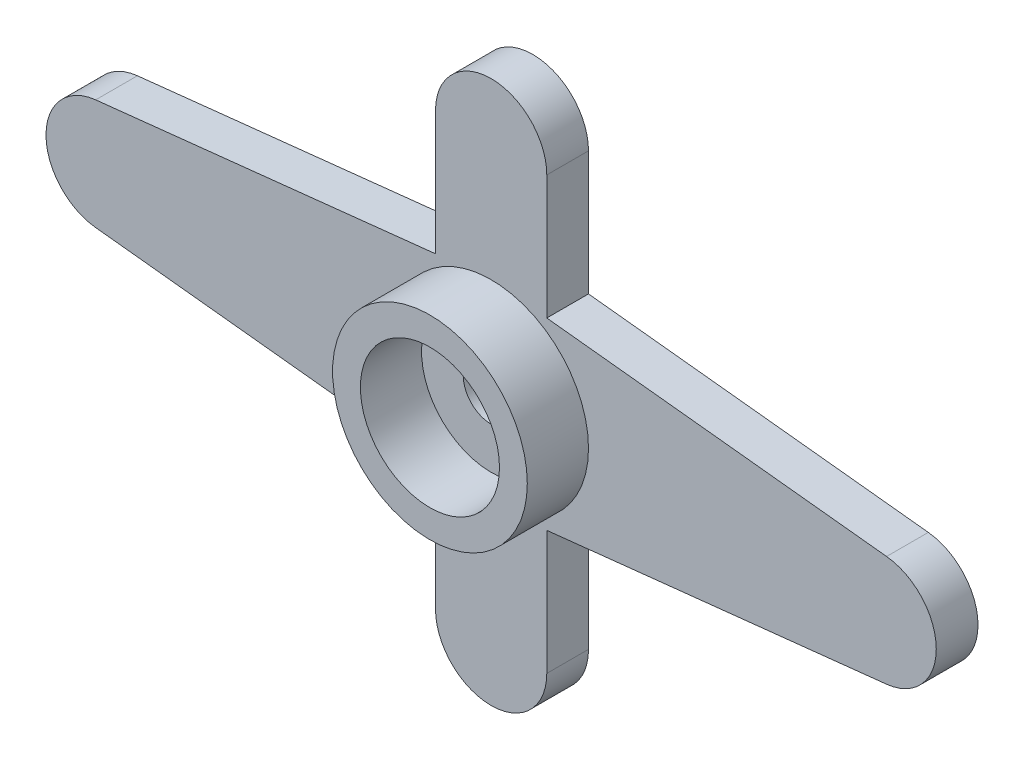
ISO-10303-21;
HEADER;
FILE_DESCRIPTION(('STEP AP214'),'2;1');
FILE_NAME('part.step','',(''),(''),'','','');
FILE_SCHEMA(('AUTOMOTIVE_DESIGN { 1 0 10303 214 1 1 1 1 }'));
ENDSEC;
DATA;
#1=APPLICATION_CONTEXT('core data for automotive mechanical design processes');
#2=APPLICATION_PROTOCOL_DEFINITION('international standard','automotive_design',2000,#1);
#3=PRODUCT_CONTEXT('',#1,'mechanical');
#4=PRODUCT('Part','Part','',(#3));
#5=PRODUCT_RELATED_PRODUCT_CATEGORY('part','',(#4));
#6=PRODUCT_DEFINITION_FORMATION('','',#4);
#7=PRODUCT_DEFINITION_CONTEXT('part definition',#1,'design');
#8=PRODUCT_DEFINITION('design','',#6,#7);
#9=PRODUCT_DEFINITION_SHAPE('','',#8);
#10=(LENGTH_UNIT() NAMED_UNIT(*) SI_UNIT(.MILLI.,.METRE.));
#11=(NAMED_UNIT(*) PLANE_ANGLE_UNIT() SI_UNIT($,.RADIAN.));
#12=(NAMED_UNIT(*) SI_UNIT($,.STERADIAN.) SOLID_ANGLE_UNIT());
#13=UNCERTAINTY_MEASURE_WITH_UNIT(LENGTH_MEASURE(1.E-05),#10,'distance_accuracy_value','');
#14=(GEOMETRIC_REPRESENTATION_CONTEXT(3) GLOBAL_UNCERTAINTY_ASSIGNED_CONTEXT((#13)) GLOBAL_UNIT_ASSIGNED_CONTEXT((#10,
#11,#12)) REPRESENTATION_CONTEXT('',''));
#15=CARTESIAN_POINT('',(0.,0.,0.));
#16=DIRECTION('',(0.,0.,1.));
#17=DIRECTION('',(1.,0.,0.));
#18=AXIS2_PLACEMENT_3D('',#15,#16,#17);
#19=CARTESIAN_POINT('',(0.,0.,-0.000999999999999916));
#20=DIRECTION('',(0.,0.,1.));
#21=DIRECTION('',(1.,0.,0.));
#22=AXIS2_PLACEMENT_3D('',#19,#20,#21);
#23=CYLINDRICAL_SURFACE('',#22,1.);
#24=CARTESIAN_POINT('',(0.,0.,1.5));
#25=DIRECTION('',(0.,0.,1.));
#26=DIRECTION('',(1.,0.,0.));
#27=AXIS2_PLACEMENT_3D('',#24,#25,#26);
#28=CIRCLE('',#27,1.);
#29=CARTESIAN_POINT('',(1.,0.,1.5));
#30=VERTEX_POINT('',#29);
#31=EDGE_CURVE('E452',#30,#30,#28,.T.);
#32=ORIENTED_EDGE('',*,*,#31,.T.);
#33=EDGE_LOOP('',(#32));
#34=FACE_BOUND('',#33,.T.);
#35=CARTESIAN_POINT('',(0.,0.,1.));
#36=DIRECTION('',(0.,0.,-1.));
#37=DIRECTION('',(-1.,0.,0.));
#38=AXIS2_PLACEMENT_3D('',#35,#36,#37);
#39=CIRCLE('',#38,1.);
#40=CARTESIAN_POINT('',(-1.,0.,1.));
#41=VERTEX_POINT('',#40);
#42=EDGE_CURVE('E39',#41,#41,#39,.F.);
#43=ORIENTED_EDGE('',*,*,#42,.F.);
#44=EDGE_LOOP('',(#43));
#45=FACE_BOUND('',#44,.T.);
#46=ADVANCED_FACE('F35',(#34,#45),#23,.F.);
#47=CARTESIAN_POINT('',(14.,0.,1.5));
#48=DIRECTION('',(0.,0.,-1.));
#49=DIRECTION('',(-1.,0.,0.));
#50=AXIS2_PLACEMENT_3D('',#47,#48,#49);
#51=CYLINDRICAL_SURFACE('',#50,2.);
#52=CARTESIAN_POINT('',(14.,0.,0.));
#53=DIRECTION('',(0.,0.,1.));
#54=DIRECTION('',(1.,0.,0.));
#55=AXIS2_PLACEMENT_3D('',#52,#53,#54);
#56=CIRCLE('',#55,2.);
#57=CARTESIAN_POINT('',(14.2142857142857,-1.98848727243929,0.));
#58=VERTEX_POINT('',#57);
#59=CARTESIAN_POINT('',(14.2142857142857,1.98848727243929,0.));
#60=VERTEX_POINT('',#59);
#61=EDGE_CURVE('E158',#58,#60,#56,.T.);
#62=ORIENTED_EDGE('',*,*,#61,.T.);
#63=DIRECTION('',(0.,0.,-1.));
#64=VECTOR('',#63,1.);
#65=CARTESIAN_POINT('',(14.2142857142857,1.98848727243929,1.5));
#66=LINE('',#65,#64);
#67=CARTESIAN_POINT('',(14.2142857142857,1.98848727243929,1.5));
#68=VERTEX_POINT('',#67);
#69=EDGE_CURVE('E45',#68,#60,#66,.T.);
#70=ORIENTED_EDGE('',*,*,#69,.F.);
#71=CARTESIAN_POINT('',(14.,0.,1.5));
#72=DIRECTION('',(0.,0.,1.));
#73=DIRECTION('',(1.,0.,0.));
#74=AXIS2_PLACEMENT_3D('',#71,#72,#73);
#75=CIRCLE('',#74,2.);
#76=CARTESIAN_POINT('',(14.2142857142857,-1.98848727243929,1.5));
#77=VERTEX_POINT('',#76);
#78=EDGE_CURVE('E181',#77,#68,#75,.T.);
#79=ORIENTED_EDGE('',*,*,#78,.F.);
#80=DIRECTION('',(0.,0.,-1.));
#81=VECTOR('',#80,1.);
#82=CARTESIAN_POINT('',(14.2142857142857,-1.98848727243929,1.5));
#83=LINE('',#82,#81);
#84=EDGE_CURVE('E154',#77,#58,#83,.T.);
#85=ORIENTED_EDGE('',*,*,#84,.T.);
#86=EDGE_LOOP('',(#62,#70,#79,#85));
#87=FACE_BOUND('',#86,.T.);
#88=ADVANCED_FACE('F37',(#87),#51,.T.);
#89=CARTESIAN_POINT('',(2.,3.30473755729266,1.5));
#90=DIRECTION('',(-0.107142857142857,-0.994243636219647,0.));
#91=DIRECTION('',(0.994243636219647,-0.107142857142857,0.));
#92=AXIS2_PLACEMENT_3D('',#89,#90,#91);
#93=PLANE('',#92);
#94=DIRECTION('',(-0.994243636219647,0.107142857142857,0.));
#95=VECTOR('',#94,1.);
#96=CARTESIAN_POINT('',(2.,3.30473755729266,0.));
#97=LINE('',#96,#95);
#98=CARTESIAN_POINT('',(2.,3.30473755729266,0.));
#99=VERTEX_POINT('',#98);
#100=EDGE_CURVE('E161',#60,#99,#97,.T.);
#101=ORIENTED_EDGE('',*,*,#100,.T.);
#102=DIRECTION('',(0.,0.,-1.));
#103=VECTOR('',#102,1.);
#104=CARTESIAN_POINT('',(2.,3.30473755729266,1.5));
#105=LINE('',#104,#103);
#106=CARTESIAN_POINT('',(2.,3.30473755729266,1.5));
#107=VERTEX_POINT('',#106);
#108=EDGE_CURVE('E203',#107,#99,#105,.T.);
#109=ORIENTED_EDGE('',*,*,#108,.F.);
#110=DIRECTION('',(-0.994243636219647,0.107142857142857,0.));
#111=VECTOR('',#110,1.);
#112=CARTESIAN_POINT('',(2.,3.30473755729266,1.5));
#113=LINE('',#112,#111);
#114=EDGE_CURVE('E109',#68,#107,#113,.T.);
#115=ORIENTED_EDGE('',*,*,#114,.F.);
#116=ORIENTED_EDGE('',*,*,#69,.T.);
#117=EDGE_LOOP('',(#101,#109,#115,#116));
#118=FACE_BOUND('',#117,.T.);
#119=ADVANCED_FACE('F207',(#118),#93,.F.);
#120=CARTESIAN_POINT('',(2.,7.75863864960814,1.5));
#121=DIRECTION('',(-1.,0.,0.));
#122=DIRECTION('',(0.,-1.,0.));
#123=AXIS2_PLACEMENT_3D('',#120,#121,#122);
#124=PLANE('',#123);
#125=DIRECTION('',(0.,1.,0.));
#126=VECTOR('',#125,1.);
#127=CARTESIAN_POINT('',(2.,7.75863864960814,0.));
#128=LINE('',#127,#126);
#129=CARTESIAN_POINT('',(2.,7.75863864960814,0.));
#130=VERTEX_POINT('',#129);
#131=EDGE_CURVE('E164',#99,#130,#128,.T.);
#132=ORIENTED_EDGE('',*,*,#131,.T.);
#133=DIRECTION('',(0.,0.,-1.));
#134=VECTOR('',#133,1.);
#135=CARTESIAN_POINT('',(2.,7.75863864960814,1.5));
#136=LINE('',#135,#134);
#137=CARTESIAN_POINT('',(2.,7.75863864960814,1.5));
#138=VERTEX_POINT('',#137);
#139=EDGE_CURVE('E200',#138,#130,#136,.T.);
#140=ORIENTED_EDGE('',*,*,#139,.F.);
#141=DIRECTION('',(0.,1.,0.));
#142=VECTOR('',#141,1.);
#143=CARTESIAN_POINT('',(2.,7.75863864960814,1.5));
#144=LINE('',#143,#142);
#145=EDGE_CURVE('E227',#107,#138,#144,.T.);
#146=ORIENTED_EDGE('',*,*,#145,.F.);
#147=ORIENTED_EDGE('',*,*,#108,.T.);
#148=EDGE_LOOP('',(#132,#140,#146,#147));
#149=FACE_BOUND('',#148,.T.);
#150=ADVANCED_FACE('F218',(#149),#124,.F.);
#151=CARTESIAN_POINT('',(0.,7.75863864960814,1.5));
#152=DIRECTION('',(0.,0.,-1.));
#153=DIRECTION('',(-1.,0.,0.));
#154=AXIS2_PLACEMENT_3D('',#151,#152,#153);
#155=CYLINDRICAL_SURFACE('',#154,2.);
#156=CARTESIAN_POINT('',(0.,7.75863864960814,0.));
#157=DIRECTION('',(0.,0.,1.));
#158=DIRECTION('',(1.,0.,0.));
#159=AXIS2_PLACEMENT_3D('',#156,#157,#158);
#160=CIRCLE('',#159,2.);
#161=CARTESIAN_POINT('',(-2.,7.75863864960814,0.));
#162=VERTEX_POINT('',#161);
#163=EDGE_CURVE('E166',#130,#162,#160,.T.);
#164=ORIENTED_EDGE('',*,*,#163,.T.);
#165=DIRECTION('',(0.,0.,-1.));
#166=VECTOR('',#165,1.);
#167=CARTESIAN_POINT('',(-2.,7.75863864960814,1.5));
#168=LINE('',#167,#166);
#169=CARTESIAN_POINT('',(-2.,7.75863864960814,1.5));
#170=VERTEX_POINT('',#169);
#171=EDGE_CURVE('E197',#170,#162,#168,.T.);
#172=ORIENTED_EDGE('',*,*,#171,.F.);
#173=CARTESIAN_POINT('',(0.,7.75863864960814,1.5));
#174=DIRECTION('',(0.,0.,1.));
#175=DIRECTION('',(1.,0.,0.));
#176=AXIS2_PLACEMENT_3D('',#173,#174,#175);
#177=CIRCLE('',#176,2.);
#178=EDGE_CURVE('E224',#138,#170,#177,.T.);
#179=ORIENTED_EDGE('',*,*,#178,.F.);
#180=ORIENTED_EDGE('',*,*,#139,.T.);
#181=EDGE_LOOP('',(#164,#172,#179,#180));
#182=FACE_BOUND('',#181,.T.);
#183=ADVANCED_FACE('F222',(#182),#155,.T.);
#184=CARTESIAN_POINT('',(-2.,7.75863864960814,1.5));
#185=DIRECTION('',(1.,0.,0.));
#186=DIRECTION('',(0.,1.,0.));
#187=AXIS2_PLACEMENT_3D('',#184,#185,#186);
#188=PLANE('',#187);
#189=DIRECTION('',(0.,-1.,0.));
#190=VECTOR('',#189,1.);
#191=CARTESIAN_POINT('',(-2.,7.75863864960814,0.));
#192=LINE('',#191,#190);
#193=CARTESIAN_POINT('',(-2.,3.30473755729266,0.));
#194=VERTEX_POINT('',#193);
#195=EDGE_CURVE('E168',#162,#194,#192,.T.);
#196=ORIENTED_EDGE('',*,*,#195,.T.);
#197=DIRECTION('',(0.,0.,-1.));
#198=VECTOR('',#197,1.);
#199=CARTESIAN_POINT('',(-2.,3.30473755729266,1.5));
#200=LINE('',#199,#198);
#201=CARTESIAN_POINT('',(-2.,3.30473755729266,1.5));
#202=VERTEX_POINT('',#201);
#203=EDGE_CURVE('E194',#202,#194,#200,.T.);
#204=ORIENTED_EDGE('',*,*,#203,.F.);
#205=DIRECTION('',(0.,-1.,0.));
#206=VECTOR('',#205,1.);
#207=CARTESIAN_POINT('',(-2.,7.75863864960814,1.5));
#208=LINE('',#207,#206);
#209=EDGE_CURVE('E226',#170,#202,#208,.T.);
#210=ORIENTED_EDGE('',*,*,#209,.F.);
#211=ORIENTED_EDGE('',*,*,#171,.T.);
#212=EDGE_LOOP('',(#196,#204,#210,#211));
#213=FACE_BOUND('',#212,.T.);
#214=ADVANCED_FACE('F258',(#213),#188,.F.);
#215=CARTESIAN_POINT('',(-2.,3.30473755729266,1.5));
#216=DIRECTION('',(0.107142857142857,-0.994243636219647,0.));
#217=DIRECTION('',(0.994243636219647,0.107142857142857,0.));
#218=AXIS2_PLACEMENT_3D('',#215,#216,#217);
#219=PLANE('',#218);
#220=DIRECTION('',(-0.994243636219647,-0.107142857142857,0.));
#221=VECTOR('',#220,1.);
#222=CARTESIAN_POINT('',(-2.,3.30473755729266,0.));
#223=LINE('',#222,#221);
#224=CARTESIAN_POINT('',(-14.2142857142857,1.98848727243929,0.));
#225=VERTEX_POINT('',#224);
#226=EDGE_CURVE('E170',#194,#225,#223,.T.);
#227=ORIENTED_EDGE('',*,*,#226,.T.);
#228=DIRECTION('',(0.,0.,-1.));
#229=VECTOR('',#228,1.);
#230=CARTESIAN_POINT('',(-14.2142857142857,1.98848727243929,1.5));
#231=LINE('',#230,#229);
#232=CARTESIAN_POINT('',(-14.2142857142857,1.98848727243929,1.5));
#233=VERTEX_POINT('',#232);
#234=EDGE_CURVE('E191',#233,#225,#231,.T.);
#235=ORIENTED_EDGE('',*,*,#234,.F.);
#236=DIRECTION('',(-0.994243636219647,-0.107142857142857,0.));
#237=VECTOR('',#236,1.);
#238=CARTESIAN_POINT('',(-2.,3.30473755729266,1.5));
#239=LINE('',#238,#237);
#240=EDGE_CURVE('E229',#202,#233,#239,.T.);
#241=ORIENTED_EDGE('',*,*,#240,.F.);
#242=ORIENTED_EDGE('',*,*,#203,.T.);
#243=EDGE_LOOP('',(#227,#235,#241,#242));
#244=FACE_BOUND('',#243,.T.);
#245=ADVANCED_FACE('F255',(#244),#219,.F.);
#246=CARTESIAN_POINT('',(-14.,0.,1.5));
#247=DIRECTION('',(0.,0.,-1.));
#248=DIRECTION('',(-1.,0.,0.));
#249=AXIS2_PLACEMENT_3D('',#246,#247,#248);
#250=CYLINDRICAL_SURFACE('',#249,2.);
#251=CARTESIAN_POINT('',(-14.,0.,0.));
#252=DIRECTION('',(0.,0.,1.));
#253=DIRECTION('',(-1.,0.,0.));
#254=AXIS2_PLACEMENT_3D('',#251,#252,#253);
#255=CIRCLE('',#254,2.);
#256=CARTESIAN_POINT('',(-14.2142857142857,-1.98848727243929,0.));
#257=VERTEX_POINT('',#256);
#258=EDGE_CURVE('E172',#225,#257,#255,.T.);
#259=ORIENTED_EDGE('',*,*,#258,.T.);
#260=DIRECTION('',(0.,0.,-1.));
#261=VECTOR('',#260,1.);
#262=CARTESIAN_POINT('',(-14.2142857142857,-1.98848727243929,1.5));
#263=LINE('',#262,#261);
#264=CARTESIAN_POINT('',(-14.2142857142857,-1.98848727243929,1.5));
#265=VERTEX_POINT('',#264);
#266=EDGE_CURVE('E188',#265,#257,#263,.T.);
#267=ORIENTED_EDGE('',*,*,#266,.F.);
#268=CARTESIAN_POINT('',(-14.,0.,1.5));
#269=DIRECTION('',(0.,0.,1.));
#270=DIRECTION('',(-1.,0.,0.));
#271=AXIS2_PLACEMENT_3D('',#268,#269,#270);
#272=CIRCLE('',#271,2.);
#273=EDGE_CURVE('E235',#233,#265,#272,.T.);
#274=ORIENTED_EDGE('',*,*,#273,.F.);
#275=ORIENTED_EDGE('',*,*,#234,.T.);
#276=EDGE_LOOP('',(#259,#267,#274,#275));
#277=FACE_BOUND('',#276,.T.);
#278=ADVANCED_FACE('F251',(#277),#250,.T.);
#279=CARTESIAN_POINT('',(-2.,-3.30473755729266,1.5));
#280=DIRECTION('',(0.107142857142857,0.994243636219647,0.));
#281=DIRECTION('',(-0.994243636219647,0.107142857142857,0.));
#282=AXIS2_PLACEMENT_3D('',#279,#280,#281);
#283=PLANE('',#282);
#284=DIRECTION('',(0.994243636219647,-0.107142857142857,0.));
#285=VECTOR('',#284,1.);
#286=CARTESIAN_POINT('',(-2.,-3.30473755729266,0.));
#287=LINE('',#286,#285);
#288=CARTESIAN_POINT('',(-2.,-3.30473755729266,0.));
#289=VERTEX_POINT('',#288);
#290=EDGE_CURVE('E174',#257,#289,#287,.T.);
#291=ORIENTED_EDGE('',*,*,#290,.T.);
#292=DIRECTION('',(0.,0.,-1.));
#293=VECTOR('',#292,1.);
#294=CARTESIAN_POINT('',(-2.,-3.30473755729266,1.5));
#295=LINE('',#294,#293);
#296=CARTESIAN_POINT('',(-2.,-3.30473755729266,1.5));
#297=VERTEX_POINT('',#296);
#298=EDGE_CURVE('E185',#297,#289,#295,.T.);
#299=ORIENTED_EDGE('',*,*,#298,.F.);
#300=DIRECTION('',(0.994243636219647,-0.107142857142857,0.));
#301=VECTOR('',#300,1.);
#302=CARTESIAN_POINT('',(-2.,-3.30473755729266,1.5));
#303=LINE('',#302,#301);
#304=EDGE_CURVE('E237',#265,#297,#303,.T.);
#305=ORIENTED_EDGE('',*,*,#304,.F.);
#306=ORIENTED_EDGE('',*,*,#266,.T.);
#307=EDGE_LOOP('',(#291,#299,#305,#306));
#308=FACE_BOUND('',#307,.T.);
#309=ADVANCED_FACE('F243',(#308),#283,.F.);
#310=CARTESIAN_POINT('',(-2.,-7.75863864960814,1.5));
#311=DIRECTION('',(1.,0.,0.));
#312=DIRECTION('',(0.,1.,0.));
#313=AXIS2_PLACEMENT_3D('',#310,#311,#312);
#314=PLANE('',#313);
#315=DIRECTION('',(0.,-1.,0.));
#316=VECTOR('',#315,1.);
#317=CARTESIAN_POINT('',(-2.,-7.75863864960814,0.));
#318=LINE('',#317,#316);
#319=CARTESIAN_POINT('',(-2.,-7.75863864960814,0.));
#320=VERTEX_POINT('',#319);
#321=EDGE_CURVE('E176',#289,#320,#318,.T.);
#322=ORIENTED_EDGE('',*,*,#321,.T.);
#323=DIRECTION('',(0.,0.,-1.));
#324=VECTOR('',#323,1.);
#325=CARTESIAN_POINT('',(-2.,-7.75863864960814,1.5));
#326=LINE('',#325,#324);
#327=CARTESIAN_POINT('',(-2.,-7.75863864960814,1.5));
#328=VERTEX_POINT('',#327);
#329=EDGE_CURVE('E149',#328,#320,#326,.T.);
#330=ORIENTED_EDGE('',*,*,#329,.F.);
#331=DIRECTION('',(0.,-1.,0.));
#332=VECTOR('',#331,1.);
#333=CARTESIAN_POINT('',(-2.,-7.75863864960814,1.5));
#334=LINE('',#333,#332);
#335=EDGE_CURVE('E140',#297,#328,#334,.T.);
#336=ORIENTED_EDGE('',*,*,#335,.F.);
#337=ORIENTED_EDGE('',*,*,#298,.T.);
#338=EDGE_LOOP('',(#322,#330,#336,#337));
#339=FACE_BOUND('',#338,.T.);
#340=ADVANCED_FACE('F247',(#339),#314,.F.);
#341=CARTESIAN_POINT('',(0.,-7.75863864960814,1.5));
#342=DIRECTION('',(0.,0.,-1.));
#343=DIRECTION('',(-1.,0.,0.));
#344=AXIS2_PLACEMENT_3D('',#341,#342,#343);
#345=CYLINDRICAL_SURFACE('',#344,2.);
#346=CARTESIAN_POINT('',(0.,-7.75863864960814,0.));
#347=DIRECTION('',(0.,0.,1.));
#348=DIRECTION('',(-1.,0.,0.));
#349=AXIS2_PLACEMENT_3D('',#346,#347,#348);
#350=CIRCLE('',#349,2.);
#351=CARTESIAN_POINT('',(2.,-7.75863864960814,0.));
#352=VERTEX_POINT('',#351);
#353=EDGE_CURVE('E148',#320,#352,#350,.T.);
#354=ORIENTED_EDGE('',*,*,#353,.T.);
#355=DIRECTION('',(0.,0.,-1.));
#356=VECTOR('',#355,1.);
#357=CARTESIAN_POINT('',(2.,-7.75863864960814,1.5));
#358=LINE('',#357,#356);
#359=CARTESIAN_POINT('',(2.,-7.75863864960814,1.5));
#360=VERTEX_POINT('',#359);
#361=EDGE_CURVE('E145',#360,#352,#358,.T.);
#362=ORIENTED_EDGE('',*,*,#361,.F.);
#363=CARTESIAN_POINT('',(0.,-7.75863864960814,1.5));
#364=DIRECTION('',(0.,0.,1.));
#365=DIRECTION('',(-1.,0.,0.));
#366=AXIS2_PLACEMENT_3D('',#363,#364,#365);
#367=CIRCLE('',#366,2.);
#368=EDGE_CURVE('E134',#328,#360,#367,.T.);
#369=ORIENTED_EDGE('',*,*,#368,.F.);
#370=ORIENTED_EDGE('',*,*,#329,.T.);
#371=EDGE_LOOP('',(#354,#362,#369,#370));
#372=FACE_BOUND('',#371,.T.);
#373=ADVANCED_FACE('F146',(#372),#345,.T.);
#374=CARTESIAN_POINT('',(2.,-7.75863864960814,1.5));
#375=DIRECTION('',(-1.,0.,0.));
#376=DIRECTION('',(0.,-1.,0.));
#377=AXIS2_PLACEMENT_3D('',#374,#375,#376);
#378=PLANE('',#377);
#379=DIRECTION('',(0.,1.,0.));
#380=VECTOR('',#379,1.);
#381=CARTESIAN_POINT('',(2.,-7.75863864960814,0.));
#382=LINE('',#381,#380);
#383=CARTESIAN_POINT('',(2.,-3.30473755729266,0.));
#384=VERTEX_POINT('',#383);
#385=EDGE_CURVE('E94',#352,#384,#382,.T.);
#386=ORIENTED_EDGE('',*,*,#385,.T.);
#387=DIRECTION('',(0.,0.,-1.));
#388=VECTOR('',#387,1.);
#389=CARTESIAN_POINT('',(2.,-3.30473755729266,1.5));
#390=LINE('',#389,#388);
#391=CARTESIAN_POINT('',(2.,-3.30473755729266,1.5));
#392=VERTEX_POINT('',#391);
#393=EDGE_CURVE('E150',#392,#384,#390,.T.);
#394=ORIENTED_EDGE('',*,*,#393,.F.);
#395=DIRECTION('',(0.,1.,0.));
#396=VECTOR('',#395,1.);
#397=CARTESIAN_POINT('',(2.,-7.75863864960814,1.5));
#398=LINE('',#397,#396);
#399=EDGE_CURVE('E138',#360,#392,#398,.T.);
#400=ORIENTED_EDGE('',*,*,#399,.F.);
#401=ORIENTED_EDGE('',*,*,#361,.T.);
#402=EDGE_LOOP('',(#386,#394,#400,#401));
#403=FACE_BOUND('',#402,.T.);
#404=ADVANCED_FACE('F152',(#403),#378,.F.);
#405=CARTESIAN_POINT('',(2.,-3.30473755729266,1.5));
#406=DIRECTION('',(-0.107142857142857,0.994243636219647,0.));
#407=DIRECTION('',(-0.994243636219647,-0.107142857142857,0.));
#408=AXIS2_PLACEMENT_3D('',#405,#406,#407);
#409=PLANE('',#408);
#410=DIRECTION('',(0.994243636219647,0.107142857142857,0.));
#411=VECTOR('',#410,1.);
#412=CARTESIAN_POINT('',(2.,-3.30473755729266,0.));
#413=LINE('',#412,#411);
#414=EDGE_CURVE('E100',#384,#58,#413,.T.);
#415=ORIENTED_EDGE('',*,*,#414,.T.);
#416=ORIENTED_EDGE('',*,*,#84,.F.);
#417=DIRECTION('',(0.994243636219647,0.107142857142857,0.));
#418=VECTOR('',#417,1.);
#419=CARTESIAN_POINT('',(2.,-3.30473755729266,1.5));
#420=LINE('',#419,#418);
#421=EDGE_CURVE('E53',#392,#77,#420,.T.);
#422=ORIENTED_EDGE('',*,*,#421,.F.);
#423=ORIENTED_EDGE('',*,*,#393,.T.);
#424=EDGE_LOOP('',(#415,#416,#422,#423));
#425=FACE_BOUND('',#424,.T.);
#426=ADVANCED_FACE('F294',(#425),#409,.F.);
#427=CARTESIAN_POINT('',(14.,0.,1.5));
#428=DIRECTION('',(0.,0.,1.));
#429=DIRECTION('',(1.,0.,0.));
#430=AXIS2_PLACEMENT_3D('',#427,#428,#429);
#431=PLANE('',#430);
#432=CARTESIAN_POINT('',(0.,0.,1.5));
#433=DIRECTION('',(0.,0.,1.));
#434=DIRECTION('',(1.,0.,0.));
#435=AXIS2_PLACEMENT_3D('',#432,#433,#434);
#436=CIRCLE('',#435,3.5);
#437=CARTESIAN_POINT('',(3.5,0.,1.5));
#438=VERTEX_POINT('',#437);
#439=EDGE_CURVE('E457',#438,#438,#436,.T.);
#440=ORIENTED_EDGE('',*,*,#439,.F.);
#441=EDGE_LOOP('',(#440));
#442=FACE_BOUND('',#441,.T.);
#443=ORIENTED_EDGE('',*,*,#78,.T.);
#444=ORIENTED_EDGE('',*,*,#114,.T.);
#445=ORIENTED_EDGE('',*,*,#145,.T.);
#446=ORIENTED_EDGE('',*,*,#178,.T.);
#447=ORIENTED_EDGE('',*,*,#209,.T.);
#448=ORIENTED_EDGE('',*,*,#240,.T.);
#449=ORIENTED_EDGE('',*,*,#273,.T.);
#450=ORIENTED_EDGE('',*,*,#304,.T.);
#451=ORIENTED_EDGE('',*,*,#335,.T.);
#452=ORIENTED_EDGE('',*,*,#368,.T.);
#453=ORIENTED_EDGE('',*,*,#399,.T.);
#454=ORIENTED_EDGE('',*,*,#421,.T.);
#455=EDGE_LOOP('',(#443,#444,#445,#446,#447,#448,#449,#450,#451,#452,#453,#454));
#456=FACE_BOUND('',#455,.T.);
#457=ADVANCED_FACE('F136',(#442,#456),#431,.T.);
#458=CARTESIAN_POINT('',(14.,0.,0.));
#459=DIRECTION('',(0.,0.,1.));
#460=DIRECTION('',(1.,0.,0.));
#461=AXIS2_PLACEMENT_3D('',#458,#459,#460);
#462=PLANE('',#461);
#463=CARTESIAN_POINT('',(0.,0.,0.));
#464=DIRECTION('',(0.,0.,-1.));
#465=DIRECTION('',(-1.,0.,0.));
#466=AXIS2_PLACEMENT_3D('',#463,#464,#465);
#467=CIRCLE('',#466,2.5);
#468=CARTESIAN_POINT('',(-2.5,0.,0.));
#469=VERTEX_POINT('',#468);
#470=EDGE_CURVE('E448',#469,#469,#467,.T.);
#471=ORIENTED_EDGE('',*,*,#470,.F.);
#472=EDGE_LOOP('',(#471));
#473=FACE_BOUND('',#472,.T.);
#474=ORIENTED_EDGE('',*,*,#61,.F.);
#475=ORIENTED_EDGE('',*,*,#414,.F.);
#476=ORIENTED_EDGE('',*,*,#385,.F.);
#477=ORIENTED_EDGE('',*,*,#353,.F.);
#478=ORIENTED_EDGE('',*,*,#321,.F.);
#479=ORIENTED_EDGE('',*,*,#290,.F.);
#480=ORIENTED_EDGE('',*,*,#258,.F.);
#481=ORIENTED_EDGE('',*,*,#226,.F.);
#482=ORIENTED_EDGE('',*,*,#195,.F.);
#483=ORIENTED_EDGE('',*,*,#163,.F.);
#484=ORIENTED_EDGE('',*,*,#131,.F.);
#485=ORIENTED_EDGE('',*,*,#100,.F.);
#486=EDGE_LOOP('',(#474,#475,#476,#477,#478,#479,#480,#481,#482,#483,#484,#485));
#487=FACE_BOUND('',#486,.T.);
#488=ADVANCED_FACE('F212',(#473,#487),#462,.F.);
#489=CARTESIAN_POINT('',(0.,0.,3.7));
#490=DIRECTION('',(0.,0.,1.));
#491=DIRECTION('',(1.,0.,0.));
#492=AXIS2_PLACEMENT_3D('',#489,#490,#491);
#493=PLANE('',#492);
#494=CARTESIAN_POINT('',(0.,0.,3.7));
#495=DIRECTION('',(0.,0.,1.));
#496=DIRECTION('',(1.,0.,0.));
#497=AXIS2_PLACEMENT_3D('',#494,#495,#496);
#498=CIRCLE('',#497,3.5);
#499=CARTESIAN_POINT('',(3.5,0.,3.7));
#500=VERTEX_POINT('',#499);
#501=EDGE_CURVE('E162',#500,#500,#498,.T.);
#502=ORIENTED_EDGE('',*,*,#501,.T.);
#503=EDGE_LOOP('',(#502));
#504=FACE_BOUND('',#503,.T.);
#505=CARTESIAN_POINT('',(0.,0.,3.7));
#506=DIRECTION('',(0.,0.,1.));
#507=DIRECTION('',(1.,0.,0.));
#508=AXIS2_PLACEMENT_3D('',#505,#506,#507);
#509=CIRCLE('',#508,2.5);
#510=CARTESIAN_POINT('',(2.5,0.,3.7));
#511=VERTEX_POINT('',#510);
#512=EDGE_CURVE('E454',#511,#511,#509,.T.);
#513=ORIENTED_EDGE('',*,*,#512,.F.);
#514=EDGE_LOOP('',(#513));
#515=FACE_BOUND('',#514,.T.);
#516=ADVANCED_FACE('F285',(#504,#515),#493,.T.);
#517=CARTESIAN_POINT('',(0.,0.,3.7));
#518=DIRECTION('',(0.,0.,-1.));
#519=DIRECTION('',(-1.,0.,0.));
#520=AXIS2_PLACEMENT_3D('',#517,#518,#519);
#521=CYLINDRICAL_SURFACE('',#520,3.5);
#522=ORIENTED_EDGE('',*,*,#501,.F.);
#523=EDGE_LOOP('',(#522));
#524=FACE_BOUND('',#523,.T.);
#525=ORIENTED_EDGE('',*,*,#439,.T.);
#526=EDGE_LOOP('',(#525));
#527=FACE_BOUND('',#526,.T.);
#528=ADVANCED_FACE('F283',(#524,#527),#521,.T.);
#529=CARTESIAN_POINT('',(0.,0.,3.7));
#530=DIRECTION('',(0.,0.,-1.));
#531=DIRECTION('',(-1.,0.,0.));
#532=AXIS2_PLACEMENT_3D('',#529,#530,#531);
#533=CYLINDRICAL_SURFACE('',#532,2.5);
#534=ORIENTED_EDGE('',*,*,#512,.T.);
#535=EDGE_LOOP('',(#534));
#536=FACE_BOUND('',#535,.T.);
#537=CARTESIAN_POINT('',(0.,0.,1.5));
#538=DIRECTION('',(0.,0.,1.));
#539=DIRECTION('',(1.,0.,0.));
#540=AXIS2_PLACEMENT_3D('',#537,#538,#539);
#541=CIRCLE('',#540,2.5);
#542=CARTESIAN_POINT('',(2.5,0.,1.5));
#543=VERTEX_POINT('',#542);
#544=EDGE_CURVE('E11',#543,#543,#541,.F.);
#545=ORIENTED_EDGE('',*,*,#544,.T.);
#546=EDGE_LOOP('',(#545));
#547=FACE_BOUND('',#546,.T.);
#548=ADVANCED_FACE('F279',(#536,#547),#533,.F.);
#549=ORIENTED_EDGE('',*,*,#31,.F.);
#550=EDGE_LOOP('',(#549));
#551=FACE_BOUND('',#550,.T.);
#552=ORIENTED_EDGE('',*,*,#544,.F.);
#553=EDGE_LOOP('',(#552));
#554=FACE_BOUND('',#553,.T.);
#555=ADVANCED_FACE('F282',(#551,#554),#431,.T.);
#556=CARTESIAN_POINT('',(0.,0.,1.));
#557=DIRECTION('',(0.,0.,-1.));
#558=DIRECTION('',(-1.,0.,0.));
#559=AXIS2_PLACEMENT_3D('',#556,#557,#558);
#560=PLANE('',#559);
#561=CARTESIAN_POINT('',(0.,0.,1.));
#562=DIRECTION('',(0.,0.,-1.));
#563=DIRECTION('',(-1.,0.,0.));
#564=AXIS2_PLACEMENT_3D('',#561,#562,#563);
#565=CIRCLE('',#564,2.5);
#566=CARTESIAN_POINT('',(-2.5,0.,1.));
#567=VERTEX_POINT('',#566);
#568=EDGE_CURVE('E445',#567,#567,#565,.T.);
#569=ORIENTED_EDGE('',*,*,#568,.T.);
#570=EDGE_LOOP('',(#569));
#571=FACE_BOUND('',#570,.T.);
#572=ORIENTED_EDGE('',*,*,#42,.T.);
#573=EDGE_LOOP('',(#572));
#574=FACE_BOUND('',#573,.T.);
#575=ADVANCED_FACE('F361',(#571,#574),#560,.T.);
#576=CARTESIAN_POINT('',(0.,0.,1.));
#577=DIRECTION('',(0.,0.,-1.));
#578=DIRECTION('',(-1.,0.,0.));
#579=AXIS2_PLACEMENT_3D('',#576,#577,#578);
#580=CYLINDRICAL_SURFACE('',#579,2.5);
#581=ORIENTED_EDGE('',*,*,#568,.F.);
#582=EDGE_LOOP('',(#581));
#583=FACE_BOUND('',#582,.T.);
#584=ORIENTED_EDGE('',*,*,#470,.T.);
#585=EDGE_LOOP('',(#584));
#586=FACE_BOUND('',#585,.T.);
#587=ADVANCED_FACE('F277',(#583,#586),#580,.F.);
#588=CLOSED_SHELL('',(#46,#88,#119,#150,#183,#214,#245,#278,#309,#340,#373,#404,#426,#457,#488,
#516,#528,#548,#555,#575,#587));
#589=MANIFOLD_SOLID_BREP('B2',#588);
#590=ADVANCED_BREP_SHAPE_REPRESENTATION('',(#18,#589),#14);
#591=SHAPE_DEFINITION_REPRESENTATION(#9,#590);
ENDSEC;
END-ISO-10303-21;
